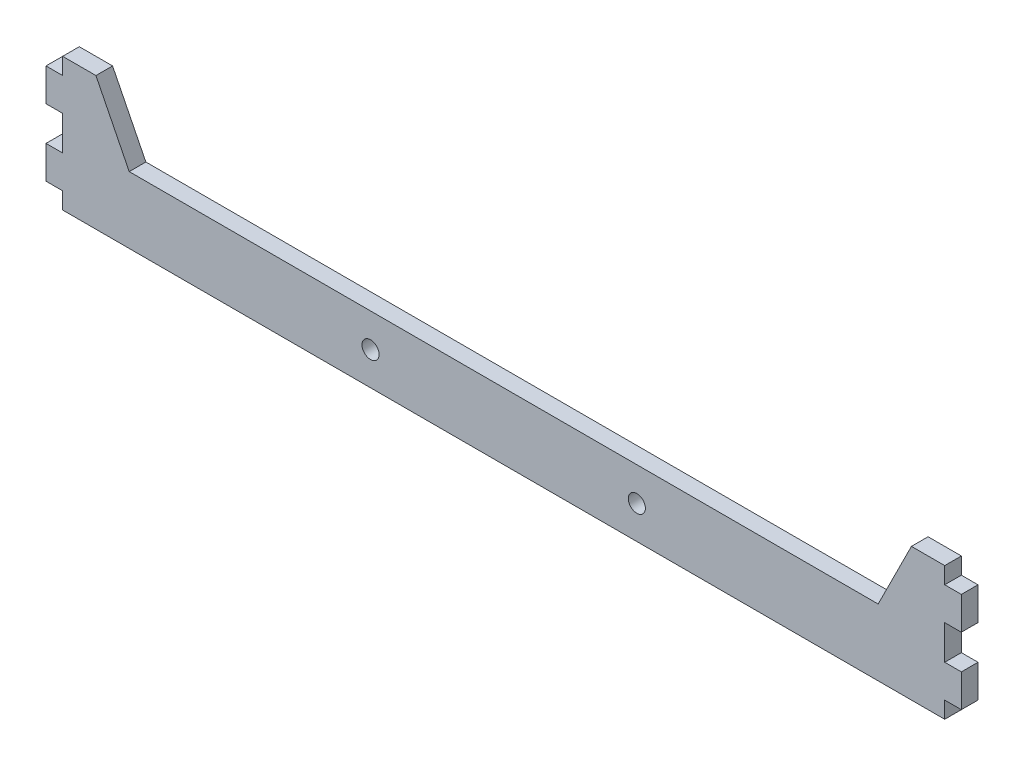
ISO-10303-21;
HEADER;
FILE_DESCRIPTION(('STEP AP214'),'2;1');
FILE_NAME('part.step','',(''),(''),'','','');
FILE_SCHEMA(('AUTOMOTIVE_DESIGN { 1 0 10303 214 1 1 1 1 }'));
ENDSEC;
DATA;
#1=APPLICATION_CONTEXT('core data for automotive mechanical design processes');
#2=APPLICATION_PROTOCOL_DEFINITION('international standard','automotive_design',2000,#1);
#3=PRODUCT_CONTEXT('',#1,'mechanical');
#4=PRODUCT('Part','Part','',(#3));
#5=PRODUCT_RELATED_PRODUCT_CATEGORY('part','',(#4));
#6=PRODUCT_DEFINITION_FORMATION('','',#4);
#7=PRODUCT_DEFINITION_CONTEXT('part definition',#1,'design');
#8=PRODUCT_DEFINITION('design','',#6,#7);
#9=PRODUCT_DEFINITION_SHAPE('','',#8);
#10=(LENGTH_UNIT() NAMED_UNIT(*) SI_UNIT(.MILLI.,.METRE.));
#11=(NAMED_UNIT(*) PLANE_ANGLE_UNIT() SI_UNIT($,.RADIAN.));
#12=(NAMED_UNIT(*) SI_UNIT($,.STERADIAN.) SOLID_ANGLE_UNIT());
#13=UNCERTAINTY_MEASURE_WITH_UNIT(LENGTH_MEASURE(1.E-05),#10,'distance_accuracy_value','');
#14=(GEOMETRIC_REPRESENTATION_CONTEXT(3) GLOBAL_UNCERTAINTY_ASSIGNED_CONTEXT((#13)) GLOBAL_UNIT_ASSIGNED_CONTEXT((#10,
#11,#12)) REPRESENTATION_CONTEXT('',''));
#15=CARTESIAN_POINT('',(0.,0.,0.));
#16=DIRECTION('',(0.,0.,1.));
#17=DIRECTION('',(1.,0.,0.));
#18=AXIS2_PLACEMENT_3D('',#15,#16,#17);
#19=CARTESIAN_POINT('',(0.,-12.7,6.35));
#20=DIRECTION('',(0.,-1.,0.));
#21=DIRECTION('',(1.,0.,0.));
#22=AXIS2_PLACEMENT_3D('',#19,#20,#21);
#23=PLANE('',#22);
#24=DIRECTION('',(-1.,0.,0.));
#25=VECTOR('',#24,1.);
#26=CARTESIAN_POINT('',(0.,-12.7,0.));
#27=LINE('',#26,#25);
#28=CARTESIAN_POINT('',(168.275,-12.7,0.));
#29=VERTEX_POINT('',#28);
#30=CARTESIAN_POINT('',(-168.275,-12.7,0.));
#31=VERTEX_POINT('',#30);
#32=EDGE_CURVE('E226',#29,#31,#27,.T.);
#33=ORIENTED_EDGE('',*,*,#32,.F.);
#34=DIRECTION('',(0.,0.,-1.));
#35=VECTOR('',#34,1.);
#36=CARTESIAN_POINT('',(168.275,-12.7,6.35));
#37=LINE('',#36,#35);
#38=CARTESIAN_POINT('',(168.275,-12.7,6.35));
#39=VERTEX_POINT('',#38);
#40=EDGE_CURVE('E11',#39,#29,#37,.T.);
#41=ORIENTED_EDGE('',*,*,#40,.F.);
#42=DIRECTION('',(-1.,0.,0.));
#43=VECTOR('',#42,1.);
#44=CARTESIAN_POINT('',(0.,-12.7,6.35));
#45=LINE('',#44,#43);
#46=CARTESIAN_POINT('',(-168.275,-12.7,6.35));
#47=VERTEX_POINT('',#46);
#48=EDGE_CURVE('E288',#39,#47,#45,.T.);
#49=ORIENTED_EDGE('',*,*,#48,.T.);
#50=DIRECTION('',(0.,0.,-1.));
#51=VECTOR('',#50,1.);
#52=CARTESIAN_POINT('',(-168.275,-12.7,6.35));
#53=LINE('',#52,#51);
#54=EDGE_CURVE('E52',#47,#31,#53,.T.);
#55=ORIENTED_EDGE('',*,*,#54,.T.);
#56=EDGE_LOOP('',(#33,#41,#49,#55));
#57=FACE_BOUND('',#56,.T.);
#58=ADVANCED_FACE('F36',(#57),#23,.T.);
#59=CARTESIAN_POINT('',(168.275,-2.94209101525652E-12,6.35));
#60=DIRECTION('',(-1.,0.,0.));
#61=DIRECTION('',(0.,-1.,0.));
#62=AXIS2_PLACEMENT_3D('',#59,#60,#61);
#63=PLANE('',#62);
#64=DIRECTION('',(0.,1.,0.));
#65=VECTOR('',#64,1.);
#66=CARTESIAN_POINT('',(168.275,-2.94209101525652E-12,0.));
#67=LINE('',#66,#65);
#68=CARTESIAN_POINT('',(168.275,-6.34999999999966,0.));
#69=VERTEX_POINT('',#68);
#70=EDGE_CURVE('E228',#29,#69,#67,.T.);
#71=ORIENTED_EDGE('',*,*,#70,.T.);
#72=DIRECTION('',(0.,0.,-1.));
#73=VECTOR('',#72,1.);
#74=CARTESIAN_POINT('',(168.275,-6.34999999999966,6.35));
#75=LINE('',#74,#73);
#76=CARTESIAN_POINT('',(168.275,-6.34999999999966,6.35));
#77=VERTEX_POINT('',#76);
#78=EDGE_CURVE('E44',#77,#69,#75,.T.);
#79=ORIENTED_EDGE('',*,*,#78,.F.);
#80=DIRECTION('',(0.,1.,0.));
#81=VECTOR('',#80,1.);
#82=CARTESIAN_POINT('',(168.275,-2.94209101525652E-12,6.35));
#83=LINE('',#82,#81);
#84=EDGE_CURVE('E359',#39,#77,#83,.T.);
#85=ORIENTED_EDGE('',*,*,#84,.F.);
#86=ORIENTED_EDGE('',*,*,#40,.T.);
#87=EDGE_LOOP('',(#71,#79,#85,#86));
#88=FACE_BOUND('',#87,.T.);
#89=ADVANCED_FACE('F420',(#88),#63,.F.);
#90=CARTESIAN_POINT('',(0.,-6.35000000000003,6.35));
#91=DIRECTION('',(0.,1.,0.));
#92=DIRECTION('',(-1.,0.,0.));
#93=AXIS2_PLACEMENT_3D('',#90,#91,#92);
#94=PLANE('',#93);
#95=DIRECTION('',(1.,0.,0.));
#96=VECTOR('',#95,1.);
#97=CARTESIAN_POINT('',(0.,-6.35000000000003,0.));
#98=LINE('',#97,#96);
#99=CARTESIAN_POINT('',(174.625,-6.34999999999965,0.));
#100=VERTEX_POINT('',#99);
#101=EDGE_CURVE('E231',#69,#100,#98,.T.);
#102=ORIENTED_EDGE('',*,*,#101,.T.);
#103=DIRECTION('',(0.,0.,-1.));
#104=VECTOR('',#103,1.);
#105=CARTESIAN_POINT('',(174.625,-6.34999999999965,6.35));
#106=LINE('',#105,#104);
#107=CARTESIAN_POINT('',(174.625,-6.34999999999965,6.35));
#108=VERTEX_POINT('',#107);
#109=EDGE_CURVE('E331',#108,#100,#106,.T.);
#110=ORIENTED_EDGE('',*,*,#109,.F.);
#111=DIRECTION('',(1.,0.,0.));
#112=VECTOR('',#111,1.);
#113=CARTESIAN_POINT('',(0.,-6.35000000000003,6.35));
#114=LINE('',#113,#112);
#115=EDGE_CURVE('E340',#77,#108,#114,.T.);
#116=ORIENTED_EDGE('',*,*,#115,.F.);
#117=ORIENTED_EDGE('',*,*,#78,.T.);
#118=EDGE_LOOP('',(#102,#110,#116,#117));
#119=FACE_BOUND('',#118,.T.);
#120=ADVANCED_FACE('F338',(#119),#94,.F.);
#121=CARTESIAN_POINT('',(174.625,7.75490782700672E-13,6.35));
#122=DIRECTION('',(-1.,0.,0.));
#123=DIRECTION('',(0.,-1.,0.));
#124=AXIS2_PLACEMENT_3D('',#121,#122,#123);
#125=PLANE('',#124);
#126=DIRECTION('',(0.,1.,0.));
#127=VECTOR('',#126,1.);
#128=CARTESIAN_POINT('',(174.625,7.75490782700672E-13,0.));
#129=LINE('',#128,#127);
#130=CARTESIAN_POINT('',(174.625,6.15000000000035,0.));
#131=VERTEX_POINT('',#130);
#132=EDGE_CURVE('E233',#100,#131,#129,.T.);
#133=ORIENTED_EDGE('',*,*,#132,.T.);
#134=DIRECTION('',(0.,0.,-1.));
#135=VECTOR('',#134,1.);
#136=CARTESIAN_POINT('',(174.625,6.15000000000035,6.35));
#137=LINE('',#136,#135);
#138=CARTESIAN_POINT('',(174.625,6.15000000000035,6.35));
#139=VERTEX_POINT('',#138);
#140=EDGE_CURVE('E329',#139,#131,#137,.T.);
#141=ORIENTED_EDGE('',*,*,#140,.F.);
#142=DIRECTION('',(0.,1.,0.));
#143=VECTOR('',#142,1.);
#144=CARTESIAN_POINT('',(174.625,7.75490782700672E-13,6.35));
#145=LINE('',#144,#143);
#146=EDGE_CURVE('E353',#108,#139,#145,.T.);
#147=ORIENTED_EDGE('',*,*,#146,.F.);
#148=ORIENTED_EDGE('',*,*,#109,.T.);
#149=EDGE_LOOP('',(#133,#141,#147,#148));
#150=FACE_BOUND('',#149,.T.);
#151=ADVANCED_FACE('F350',(#150),#125,.F.);
#152=CARTESIAN_POINT('',(0.,6.15000000000002,6.35));
#153=DIRECTION('',(0.,1.,0.));
#154=DIRECTION('',(-1.,0.,0.));
#155=AXIS2_PLACEMENT_3D('',#152,#153,#154);
#156=PLANE('',#155);
#157=DIRECTION('',(1.,0.,0.));
#158=VECTOR('',#157,1.);
#159=CARTESIAN_POINT('',(0.,6.15000000000002,0.));
#160=LINE('',#159,#158);
#161=CARTESIAN_POINT('',(168.275,6.15000000000034,0.));
#162=VERTEX_POINT('',#161);
#163=EDGE_CURVE('E236',#162,#131,#160,.T.);
#164=ORIENTED_EDGE('',*,*,#163,.F.);
#165=DIRECTION('',(0.,0.,-1.));
#166=VECTOR('',#165,1.);
#167=CARTESIAN_POINT('',(168.275,6.15000000000034,6.35));
#168=LINE('',#167,#166);
#169=CARTESIAN_POINT('',(168.275,6.15000000000034,6.35));
#170=VERTEX_POINT('',#169);
#171=EDGE_CURVE('E327',#170,#162,#168,.T.);
#172=ORIENTED_EDGE('',*,*,#171,.F.);
#173=DIRECTION('',(1.,0.,0.));
#174=VECTOR('',#173,1.);
#175=CARTESIAN_POINT('',(0.,6.15000000000002,6.35));
#176=LINE('',#175,#174);
#177=EDGE_CURVE('E355',#170,#139,#176,.T.);
#178=ORIENTED_EDGE('',*,*,#177,.T.);
#179=ORIENTED_EDGE('',*,*,#140,.T.);
#180=EDGE_LOOP('',(#164,#172,#178,#179));
#181=FACE_BOUND('',#180,.T.);
#182=ADVANCED_FACE('F649',(#181),#156,.T.);
#183=CARTESIAN_POINT('',(168.275,1.42612808754815E-12,6.35));
#184=DIRECTION('',(-1.,0.,0.));
#185=DIRECTION('',(0.,-1.,0.));
#186=AXIS2_PLACEMENT_3D('',#183,#184,#185);
#187=PLANE('',#186);
#188=DIRECTION('',(0.,1.,0.));
#189=VECTOR('',#188,1.);
#190=CARTESIAN_POINT('',(168.275,1.42612808754815E-12,0.));
#191=LINE('',#190,#189);
#192=CARTESIAN_POINT('',(168.275,19.2500000000003,0.));
#193=VERTEX_POINT('',#192);
#194=EDGE_CURVE('E239',#162,#193,#191,.T.);
#195=ORIENTED_EDGE('',*,*,#194,.T.);
#196=DIRECTION('',(0.,0.,-1.));
#197=VECTOR('',#196,1.);
#198=CARTESIAN_POINT('',(168.275,19.2500000000003,6.35));
#199=LINE('',#198,#197);
#200=CARTESIAN_POINT('',(168.275,19.2500000000003,6.35));
#201=VERTEX_POINT('',#200);
#202=EDGE_CURVE('E324',#201,#193,#199,.T.);
#203=ORIENTED_EDGE('',*,*,#202,.F.);
#204=DIRECTION('',(0.,1.,0.));
#205=VECTOR('',#204,1.);
#206=CARTESIAN_POINT('',(168.275,1.42612808754815E-12,6.35));
#207=LINE('',#206,#205);
#208=EDGE_CURVE('E357',#170,#201,#207,.T.);
#209=ORIENTED_EDGE('',*,*,#208,.F.);
#210=ORIENTED_EDGE('',*,*,#171,.T.);
#211=EDGE_LOOP('',(#195,#203,#209,#210));
#212=FACE_BOUND('',#211,.T.);
#213=ADVANCED_FACE('F639',(#212),#187,.F.);
#214=CARTESIAN_POINT('',(0.,19.25,6.35));
#215=DIRECTION('',(0.,1.,0.));
#216=DIRECTION('',(-1.,0.,0.));
#217=AXIS2_PLACEMENT_3D('',#214,#215,#216);
#218=PLANE('',#217);
#219=DIRECTION('',(1.,0.,0.));
#220=VECTOR('',#219,1.);
#221=CARTESIAN_POINT('',(0.,19.25,0.));
#222=LINE('',#221,#220);
#223=CARTESIAN_POINT('',(174.625,19.2500000000004,0.));
#224=VERTEX_POINT('',#223);
#225=EDGE_CURVE('E241',#193,#224,#222,.T.);
#226=ORIENTED_EDGE('',*,*,#225,.T.);
#227=DIRECTION('',(0.,0.,-1.));
#228=VECTOR('',#227,1.);
#229=CARTESIAN_POINT('',(174.625,19.2500000000004,6.35));
#230=LINE('',#229,#228);
#231=CARTESIAN_POINT('',(174.625,19.2500000000004,6.35));
#232=VERTEX_POINT('',#231);
#233=EDGE_CURVE('E322',#232,#224,#230,.T.);
#234=ORIENTED_EDGE('',*,*,#233,.F.);
#235=DIRECTION('',(1.,0.,0.));
#236=VECTOR('',#235,1.);
#237=CARTESIAN_POINT('',(0.,19.25,6.35));
#238=LINE('',#237,#236);
#239=EDGE_CURVE('E364',#201,#232,#238,.T.);
#240=ORIENTED_EDGE('',*,*,#239,.F.);
#241=ORIENTED_EDGE('',*,*,#202,.T.);
#242=EDGE_LOOP('',(#226,#234,#240,#241));
#243=FACE_BOUND('',#242,.T.);
#244=ADVANCED_FACE('F629',(#243),#218,.F.);
#245=CARTESIAN_POINT('',(174.625,7.75490782700672E-13,6.35));
#246=DIRECTION('',(1.,0.,0.));
#247=DIRECTION('',(0.,1.,0.));
#248=AXIS2_PLACEMENT_3D('',#245,#246,#247);
#249=PLANE('',#248);
#250=DIRECTION('',(0.,-1.,0.));
#251=VECTOR('',#250,1.);
#252=CARTESIAN_POINT('',(174.625,7.75490782700672E-13,0.));
#253=LINE('',#252,#251);
#254=CARTESIAN_POINT('',(174.625,31.7500000000004,0.));
#255=VERTEX_POINT('',#254);
#256=EDGE_CURVE('E244',#255,#224,#253,.T.);
#257=ORIENTED_EDGE('',*,*,#256,.F.);
#258=DIRECTION('',(0.,0.,-1.));
#259=VECTOR('',#258,1.);
#260=CARTESIAN_POINT('',(174.625,31.7500000000004,6.35));
#261=LINE('',#260,#259);
#262=CARTESIAN_POINT('',(174.625,31.7500000000004,6.35));
#263=VERTEX_POINT('',#262);
#264=EDGE_CURVE('E320',#263,#255,#261,.T.);
#265=ORIENTED_EDGE('',*,*,#264,.F.);
#266=DIRECTION('',(0.,-1.,0.));
#267=VECTOR('',#266,1.);
#268=CARTESIAN_POINT('',(174.625,7.75490782700672E-13,6.35));
#269=LINE('',#268,#267);
#270=EDGE_CURVE('E366',#263,#232,#269,.T.);
#271=ORIENTED_EDGE('',*,*,#270,.T.);
#272=ORIENTED_EDGE('',*,*,#233,.T.);
#273=EDGE_LOOP('',(#257,#265,#271,#272));
#274=FACE_BOUND('',#273,.T.);
#275=ADVANCED_FACE('F619',(#274),#249,.T.);
#276=CARTESIAN_POINT('',(0.,31.75,6.35));
#277=DIRECTION('',(0.,1.,0.));
#278=DIRECTION('',(-1.,0.,0.));
#279=AXIS2_PLACEMENT_3D('',#276,#277,#278);
#280=PLANE('',#279);
#281=DIRECTION('',(1.,0.,0.));
#282=VECTOR('',#281,1.);
#283=CARTESIAN_POINT('',(0.,31.75,0.));
#284=LINE('',#283,#282);
#285=CARTESIAN_POINT('',(168.275,31.7500000000003,0.));
#286=VERTEX_POINT('',#285);
#287=EDGE_CURVE('E247',#286,#255,#284,.T.);
#288=ORIENTED_EDGE('',*,*,#287,.F.);
#289=DIRECTION('',(0.,0.,-1.));
#290=VECTOR('',#289,1.);
#291=CARTESIAN_POINT('',(168.275,31.7500000000003,6.35));
#292=LINE('',#291,#290);
#293=CARTESIAN_POINT('',(168.275,31.7500000000003,6.35));
#294=VERTEX_POINT('',#293);
#295=EDGE_CURVE('E318',#294,#286,#292,.T.);
#296=ORIENTED_EDGE('',*,*,#295,.F.);
#297=DIRECTION('',(1.,0.,0.));
#298=VECTOR('',#297,1.);
#299=CARTESIAN_POINT('',(0.,31.75,6.35));
#300=LINE('',#299,#298);
#301=EDGE_CURVE('E369',#294,#263,#300,.T.);
#302=ORIENTED_EDGE('',*,*,#301,.T.);
#303=ORIENTED_EDGE('',*,*,#264,.T.);
#304=EDGE_LOOP('',(#288,#296,#302,#303));
#305=FACE_BOUND('',#304,.T.);
#306=ADVANCED_FACE('F609',(#305),#280,.T.);
#307=CARTESIAN_POINT('',(168.275,0.,6.35));
#308=DIRECTION('',(-1.,0.,0.));
#309=DIRECTION('',(0.,0.,1.));
#310=AXIS2_PLACEMENT_3D('',#307,#308,#309);
#311=PLANE('',#310);
#312=DIRECTION('',(0.,1.,0.));
#313=VECTOR('',#312,1.);
#314=CARTESIAN_POINT('',(168.275,0.,0.));
#315=LINE('',#314,#313);
#316=CARTESIAN_POINT('',(168.275,38.1000000000003,0.));
#317=VERTEX_POINT('',#316);
#318=EDGE_CURVE('E250',#286,#317,#315,.T.);
#319=ORIENTED_EDGE('',*,*,#318,.T.);
#320=DIRECTION('',(0.,0.,-1.));
#321=VECTOR('',#320,1.);
#322=CARTESIAN_POINT('',(168.275,38.1000000000003,6.35));
#323=LINE('',#322,#321);
#324=CARTESIAN_POINT('',(168.275,38.1000000000003,6.35));
#325=VERTEX_POINT('',#324);
#326=EDGE_CURVE('E315',#325,#317,#323,.T.);
#327=ORIENTED_EDGE('',*,*,#326,.F.);
#328=DIRECTION('',(0.,1.,0.));
#329=VECTOR('',#328,1.);
#330=CARTESIAN_POINT('',(168.275,0.,6.35));
#331=LINE('',#330,#329);
#332=EDGE_CURVE('E372',#294,#325,#331,.T.);
#333=ORIENTED_EDGE('',*,*,#332,.F.);
#334=ORIENTED_EDGE('',*,*,#295,.T.);
#335=EDGE_LOOP('',(#319,#327,#333,#334));
#336=FACE_BOUND('',#335,.T.);
#337=ADVANCED_FACE('F599',(#336),#311,.F.);
#338=CARTESIAN_POINT('',(0.,38.1,6.35));
#339=DIRECTION('',(0.,-1.,0.));
#340=DIRECTION('',(1.,0.,0.));
#341=AXIS2_PLACEMENT_3D('',#338,#339,#340);
#342=PLANE('',#341);
#343=DIRECTION('',(-1.,0.,0.));
#344=VECTOR('',#343,1.);
#345=CARTESIAN_POINT('',(0.,38.1,0.));
#346=LINE('',#345,#344);
#347=CARTESIAN_POINT('',(155.575,38.1000000000003,0.));
#348=VERTEX_POINT('',#347);
#349=EDGE_CURVE('E252',#317,#348,#346,.T.);
#350=ORIENTED_EDGE('',*,*,#349,.T.);
#351=DIRECTION('',(0.,0.,-1.));
#352=VECTOR('',#351,1.);
#353=CARTESIAN_POINT('',(155.575,38.1000000000003,6.35));
#354=LINE('',#353,#352);
#355=CARTESIAN_POINT('',(155.575,38.1000000000003,6.35));
#356=VERTEX_POINT('',#355);
#357=EDGE_CURVE('E312',#356,#348,#354,.T.);
#358=ORIENTED_EDGE('',*,*,#357,.F.);
#359=DIRECTION('',(-1.,0.,0.));
#360=VECTOR('',#359,1.);
#361=CARTESIAN_POINT('',(0.,38.1,6.35));
#362=LINE('',#361,#360);
#363=EDGE_CURVE('E374',#325,#356,#362,.T.);
#364=ORIENTED_EDGE('',*,*,#363,.F.);
#365=ORIENTED_EDGE('',*,*,#326,.T.);
#366=EDGE_LOOP('',(#350,#358,#364,#365));
#367=FACE_BOUND('',#366,.T.);
#368=ADVANCED_FACE('F588',(#367),#342,.F.);
#369=CARTESIAN_POINT('',(109.220000000001,-54.6099999999995,6.35));
#370=DIRECTION('',(0.894427190999919,-0.447213595499952,0.));
#371=DIRECTION('',(0.447213595499953,0.894427190999919,0.));
#372=AXIS2_PLACEMENT_3D('',#369,#370,#371);
#373=PLANE('',#372);
#374=DIRECTION('',(-0.447213595499953,-0.894427190999919,0.));
#375=VECTOR('',#374,1.);
#376=CARTESIAN_POINT('',(109.220000000001,-54.6099999999995,0.));
#377=LINE('',#376,#375);
#378=CARTESIAN_POINT('',(142.875,12.7,0.));
#379=VERTEX_POINT('',#378);
#380=EDGE_CURVE('E254',#348,#379,#377,.T.);
#381=ORIENTED_EDGE('',*,*,#380,.T.);
#382=DIRECTION('',(0.,0.,-1.));
#383=VECTOR('',#382,1.);
#384=CARTESIAN_POINT('',(142.875,12.7,6.35));
#385=LINE('',#384,#383);
#386=CARTESIAN_POINT('',(142.875,12.7,6.35));
#387=VERTEX_POINT('',#386);
#388=EDGE_CURVE('E309',#387,#379,#385,.T.);
#389=ORIENTED_EDGE('',*,*,#388,.F.);
#390=DIRECTION('',(-0.447213595499953,-0.894427190999919,0.));
#391=VECTOR('',#390,1.);
#392=CARTESIAN_POINT('',(109.220000000001,-54.6099999999995,6.35));
#393=LINE('',#392,#391);
#394=EDGE_CURVE('E376',#356,#387,#393,.T.);
#395=ORIENTED_EDGE('',*,*,#394,.F.);
#396=ORIENTED_EDGE('',*,*,#357,.T.);
#397=EDGE_LOOP('',(#381,#389,#395,#396));
#398=FACE_BOUND('',#397,.T.);
#399=ADVANCED_FACE('F577',(#398),#373,.F.);
#400=CARTESIAN_POINT('',(0.,12.7,6.35));
#401=DIRECTION('',(0.,-1.,0.));
#402=DIRECTION('',(1.,0.,0.));
#403=AXIS2_PLACEMENT_3D('',#400,#401,#402);
#404=PLANE('',#403);
#405=DIRECTION('',(-1.,0.,0.));
#406=VECTOR('',#405,1.);
#407=CARTESIAN_POINT('',(0.,12.7,0.));
#408=LINE('',#407,#406);
#409=CARTESIAN_POINT('',(-142.875,12.7,0.));
#410=VERTEX_POINT('',#409);
#411=EDGE_CURVE('E256',#379,#410,#408,.T.);
#412=ORIENTED_EDGE('',*,*,#411,.T.);
#413=DIRECTION('',(0.,0.,-1.));
#414=VECTOR('',#413,1.);
#415=CARTESIAN_POINT('',(-142.875,12.7,6.35));
#416=LINE('',#415,#414);
#417=CARTESIAN_POINT('',(-142.875,12.7,6.35));
#418=VERTEX_POINT('',#417);
#419=EDGE_CURVE('E307',#418,#410,#416,.T.);
#420=ORIENTED_EDGE('',*,*,#419,.F.);
#421=DIRECTION('',(-1.,0.,0.));
#422=VECTOR('',#421,1.);
#423=CARTESIAN_POINT('',(0.,12.7,6.35));
#424=LINE('',#423,#422);
#425=EDGE_CURVE('E378',#387,#418,#424,.T.);
#426=ORIENTED_EDGE('',*,*,#425,.F.);
#427=ORIENTED_EDGE('',*,*,#388,.T.);
#428=EDGE_LOOP('',(#412,#420,#426,#427));
#429=FACE_BOUND('',#428,.T.);
#430=ADVANCED_FACE('F567',(#429),#404,.F.);
#431=CARTESIAN_POINT('',(-109.22,-54.61,6.35));
#432=DIRECTION('',(0.894427190999916,0.447213595499958,0.));
#433=DIRECTION('',(-0.447213595499958,0.894427190999916,0.));
#434=AXIS2_PLACEMENT_3D('',#431,#432,#433);
#435=PLANE('',#434);
#436=DIRECTION('',(0.447213595499958,-0.894427190999916,0.));
#437=VECTOR('',#436,1.);
#438=CARTESIAN_POINT('',(-109.22,-54.61,0.));
#439=LINE('',#438,#437);
#440=CARTESIAN_POINT('',(-155.575,38.1,0.));
#441=VERTEX_POINT('',#440);
#442=EDGE_CURVE('E259',#441,#410,#439,.T.);
#443=ORIENTED_EDGE('',*,*,#442,.F.);
#444=DIRECTION('',(0.,0.,-1.));
#445=VECTOR('',#444,1.);
#446=CARTESIAN_POINT('',(-155.575,38.1,6.35));
#447=LINE('',#446,#445);
#448=CARTESIAN_POINT('',(-155.575,38.1,6.35));
#449=VERTEX_POINT('',#448);
#450=EDGE_CURVE('E305',#449,#441,#447,.T.);
#451=ORIENTED_EDGE('',*,*,#450,.F.);
#452=DIRECTION('',(0.447213595499958,-0.894427190999916,0.));
#453=VECTOR('',#452,1.);
#454=CARTESIAN_POINT('',(-109.22,-54.61,6.35));
#455=LINE('',#454,#453);
#456=EDGE_CURVE('E380',#449,#418,#455,.T.);
#457=ORIENTED_EDGE('',*,*,#456,.T.);
#458=ORIENTED_EDGE('',*,*,#419,.T.);
#459=EDGE_LOOP('',(#443,#451,#457,#458));
#460=FACE_BOUND('',#459,.T.);
#461=ADVANCED_FACE('F557',(#460),#435,.T.);
#462=CARTESIAN_POINT('',(0.,38.1,6.35));
#463=DIRECTION('',(0.,1.,0.));
#464=DIRECTION('',(0.,0.,1.));
#465=AXIS2_PLACEMENT_3D('',#462,#463,#464);
#466=PLANE('',#465);
#467=DIRECTION('',(1.,0.,0.));
#468=VECTOR('',#467,1.);
#469=CARTESIAN_POINT('',(0.,38.1,0.));
#470=LINE('',#469,#468);
#471=CARTESIAN_POINT('',(-168.275,38.1,0.));
#472=VERTEX_POINT('',#471);
#473=EDGE_CURVE('E262',#472,#441,#470,.T.);
#474=ORIENTED_EDGE('',*,*,#473,.F.);
#475=DIRECTION('',(0.,0.,-1.));
#476=VECTOR('',#475,1.);
#477=CARTESIAN_POINT('',(-168.275,38.1,6.35));
#478=LINE('',#477,#476);
#479=CARTESIAN_POINT('',(-168.275,38.1,6.35));
#480=VERTEX_POINT('',#479);
#481=EDGE_CURVE('E303',#480,#472,#478,.T.);
#482=ORIENTED_EDGE('',*,*,#481,.F.);
#483=DIRECTION('',(1.,0.,0.));
#484=VECTOR('',#483,1.);
#485=CARTESIAN_POINT('',(0.,38.1,6.35));
#486=LINE('',#485,#484);
#487=EDGE_CURVE('E383',#480,#449,#486,.T.);
#488=ORIENTED_EDGE('',*,*,#487,.T.);
#489=ORIENTED_EDGE('',*,*,#450,.T.);
#490=EDGE_LOOP('',(#474,#482,#488,#489));
#491=FACE_BOUND('',#490,.T.);
#492=ADVANCED_FACE('F547',(#491),#466,.T.);
#493=CARTESIAN_POINT('',(-168.275,0.,6.35));
#494=DIRECTION('',(-1.,0.,0.));
#495=DIRECTION('',(0.,0.,1.));
#496=AXIS2_PLACEMENT_3D('',#493,#494,#495);
#497=PLANE('',#496);
#498=DIRECTION('',(0.,1.,0.));
#499=VECTOR('',#498,1.);
#500=CARTESIAN_POINT('',(-168.275,0.,0.));
#501=LINE('',#500,#499);
#502=CARTESIAN_POINT('',(-168.275,31.75,0.));
#503=VERTEX_POINT('',#502);
#504=EDGE_CURVE('E265',#503,#472,#501,.T.);
#505=ORIENTED_EDGE('',*,*,#504,.F.);
#506=DIRECTION('',(0.,0.,-1.));
#507=VECTOR('',#506,1.);
#508=CARTESIAN_POINT('',(-168.275,31.75,6.35));
#509=LINE('',#508,#507);
#510=CARTESIAN_POINT('',(-168.275,31.75,6.35));
#511=VERTEX_POINT('',#510);
#512=EDGE_CURVE('E301',#511,#503,#509,.T.);
#513=ORIENTED_EDGE('',*,*,#512,.F.);
#514=DIRECTION('',(0.,1.,0.));
#515=VECTOR('',#514,1.);
#516=CARTESIAN_POINT('',(-168.275,0.,6.35));
#517=LINE('',#516,#515);
#518=EDGE_CURVE('E386',#511,#480,#517,.T.);
#519=ORIENTED_EDGE('',*,*,#518,.T.);
#520=ORIENTED_EDGE('',*,*,#481,.T.);
#521=EDGE_LOOP('',(#505,#513,#519,#520));
#522=FACE_BOUND('',#521,.T.);
#523=ADVANCED_FACE('F537',(#522),#497,.T.);
#524=CARTESIAN_POINT('',(0.,31.75,6.35));
#525=DIRECTION('',(0.,-1.,0.));
#526=DIRECTION('',(0.,0.,-1.));
#527=AXIS2_PLACEMENT_3D('',#524,#525,#526);
#528=PLANE('',#527);
#529=DIRECTION('',(-1.,0.,0.));
#530=VECTOR('',#529,1.);
#531=CARTESIAN_POINT('',(0.,31.75,0.));
#532=LINE('',#531,#530);
#533=CARTESIAN_POINT('',(-174.625,31.75,0.));
#534=VERTEX_POINT('',#533);
#535=EDGE_CURVE('E268',#503,#534,#532,.T.);
#536=ORIENTED_EDGE('',*,*,#535,.T.);
#537=DIRECTION('',(0.,0.,-1.));
#538=VECTOR('',#537,1.);
#539=CARTESIAN_POINT('',(-174.625,31.75,6.35));
#540=LINE('',#539,#538);
#541=CARTESIAN_POINT('',(-174.625,31.75,6.35));
#542=VERTEX_POINT('',#541);
#543=EDGE_CURVE('E298',#542,#534,#540,.T.);
#544=ORIENTED_EDGE('',*,*,#543,.F.);
#545=DIRECTION('',(-1.,0.,0.));
#546=VECTOR('',#545,1.);
#547=CARTESIAN_POINT('',(0.,31.75,6.35));
#548=LINE('',#547,#546);
#549=EDGE_CURVE('E389',#511,#542,#548,.T.);
#550=ORIENTED_EDGE('',*,*,#549,.F.);
#551=ORIENTED_EDGE('',*,*,#512,.T.);
#552=EDGE_LOOP('',(#536,#544,#550,#551));
#553=FACE_BOUND('',#552,.T.);
#554=ADVANCED_FACE('F527',(#553),#528,.F.);
#555=CARTESIAN_POINT('',(-174.625,0.,6.35));
#556=DIRECTION('',(1.,0.,0.));
#557=DIRECTION('',(0.,0.,-1.));
#558=AXIS2_PLACEMENT_3D('',#555,#556,#557);
#559=PLANE('',#558);
#560=DIRECTION('',(0.,-1.,0.));
#561=VECTOR('',#560,1.);
#562=CARTESIAN_POINT('',(-174.625,0.,0.));
#563=LINE('',#562,#561);
#564=CARTESIAN_POINT('',(-174.625,19.25,0.));
#565=VERTEX_POINT('',#564);
#566=EDGE_CURVE('E270',#534,#565,#563,.T.);
#567=ORIENTED_EDGE('',*,*,#566,.T.);
#568=DIRECTION('',(0.,0.,-1.));
#569=VECTOR('',#568,1.);
#570=CARTESIAN_POINT('',(-174.625,19.25,6.35));
#571=LINE('',#570,#569);
#572=CARTESIAN_POINT('',(-174.625,19.25,6.35));
#573=VERTEX_POINT('',#572);
#574=EDGE_CURVE('E296',#573,#565,#571,.T.);
#575=ORIENTED_EDGE('',*,*,#574,.F.);
#576=DIRECTION('',(0.,-1.,0.));
#577=VECTOR('',#576,1.);
#578=CARTESIAN_POINT('',(-174.625,0.,6.35));
#579=LINE('',#578,#577);
#580=EDGE_CURVE('E391',#542,#573,#579,.T.);
#581=ORIENTED_EDGE('',*,*,#580,.F.);
#582=ORIENTED_EDGE('',*,*,#543,.T.);
#583=EDGE_LOOP('',(#567,#575,#581,#582));
#584=FACE_BOUND('',#583,.T.);
#585=ADVANCED_FACE('F518',(#584),#559,.F.);
#586=CARTESIAN_POINT('',(0.,19.25,6.35));
#587=DIRECTION('',(0.,-1.,0.));
#588=DIRECTION('',(0.,0.,-1.));
#589=AXIS2_PLACEMENT_3D('',#586,#587,#588);
#590=PLANE('',#589);
#591=DIRECTION('',(-1.,0.,0.));
#592=VECTOR('',#591,1.);
#593=CARTESIAN_POINT('',(0.,19.25,0.));
#594=LINE('',#593,#592);
#595=CARTESIAN_POINT('',(-168.275,19.25,0.));
#596=VERTEX_POINT('',#595);
#597=EDGE_CURVE('E273',#596,#565,#594,.T.);
#598=ORIENTED_EDGE('',*,*,#597,.F.);
#599=DIRECTION('',(0.,0.,-1.));
#600=VECTOR('',#599,1.);
#601=CARTESIAN_POINT('',(-168.275,19.25,6.35));
#602=LINE('',#601,#600);
#603=CARTESIAN_POINT('',(-168.275,19.25,6.35));
#604=VERTEX_POINT('',#603);
#605=EDGE_CURVE('E294',#604,#596,#602,.T.);
#606=ORIENTED_EDGE('',*,*,#605,.F.);
#607=DIRECTION('',(-1.,0.,0.));
#608=VECTOR('',#607,1.);
#609=CARTESIAN_POINT('',(0.,19.25,6.35));
#610=LINE('',#609,#608);
#611=EDGE_CURVE('E393',#604,#573,#610,.T.);
#612=ORIENTED_EDGE('',*,*,#611,.T.);
#613=ORIENTED_EDGE('',*,*,#574,.T.);
#614=EDGE_LOOP('',(#598,#606,#612,#613));
#615=FACE_BOUND('',#614,.T.);
#616=ADVANCED_FACE('F406',(#615),#590,.T.);
#617=CARTESIAN_POINT('',(-168.275,0.,6.35));
#618=DIRECTION('',(-1.,0.,0.));
#619=DIRECTION('',(0.,0.,1.));
#620=AXIS2_PLACEMENT_3D('',#617,#618,#619);
#621=PLANE('',#620);
#622=DIRECTION('',(0.,1.,0.));
#623=VECTOR('',#622,1.);
#624=CARTESIAN_POINT('',(-168.275,0.,0.));
#625=LINE('',#624,#623);
#626=CARTESIAN_POINT('',(-168.275,6.14999999999997,0.));
#627=VERTEX_POINT('',#626);
#628=EDGE_CURVE('E276',#627,#596,#625,.T.);
#629=ORIENTED_EDGE('',*,*,#628,.F.);
#630=DIRECTION('',(0.,0.,-1.));
#631=VECTOR('',#630,1.);
#632=CARTESIAN_POINT('',(-168.275,6.14999999999997,6.35));
#633=LINE('',#632,#631);
#634=CARTESIAN_POINT('',(-168.275,6.14999999999997,6.35));
#635=VERTEX_POINT('',#634);
#636=EDGE_CURVE('E292',#635,#627,#633,.T.);
#637=ORIENTED_EDGE('',*,*,#636,.F.);
#638=DIRECTION('',(0.,1.,0.));
#639=VECTOR('',#638,1.);
#640=CARTESIAN_POINT('',(-168.275,0.,6.35));
#641=LINE('',#640,#639);
#642=EDGE_CURVE('E396',#635,#604,#641,.T.);
#643=ORIENTED_EDGE('',*,*,#642,.T.);
#644=ORIENTED_EDGE('',*,*,#605,.T.);
#645=EDGE_LOOP('',(#629,#637,#643,#644));
#646=FACE_BOUND('',#645,.T.);
#647=ADVANCED_FACE('F400',(#646),#621,.T.);
#648=CARTESIAN_POINT('',(0.,6.15000000000002,6.35));
#649=DIRECTION('',(0.,-1.,0.));
#650=DIRECTION('',(1.,0.,0.));
#651=AXIS2_PLACEMENT_3D('',#648,#649,#650);
#652=PLANE('',#651);
#653=DIRECTION('',(-1.,0.,0.));
#654=VECTOR('',#653,1.);
#655=CARTESIAN_POINT('',(0.,6.15000000000002,0.));
#656=LINE('',#655,#654);
#657=CARTESIAN_POINT('',(-174.625,6.14999999999997,0.));
#658=VERTEX_POINT('',#657);
#659=EDGE_CURVE('E279',#627,#658,#656,.T.);
#660=ORIENTED_EDGE('',*,*,#659,.T.);
#661=DIRECTION('',(0.,0.,-1.));
#662=VECTOR('',#661,1.);
#663=CARTESIAN_POINT('',(-174.625,6.14999999999997,6.35));
#664=LINE('',#663,#662);
#665=CARTESIAN_POINT('',(-174.625,6.14999999999997,6.35));
#666=VERTEX_POINT('',#665);
#667=EDGE_CURVE('E207',#666,#658,#664,.T.);
#668=ORIENTED_EDGE('',*,*,#667,.F.);
#669=DIRECTION('',(-1.,0.,0.));
#670=VECTOR('',#669,1.);
#671=CARTESIAN_POINT('',(0.,6.15000000000002,6.35));
#672=LINE('',#671,#670);
#673=EDGE_CURVE('E217',#635,#666,#672,.T.);
#674=ORIENTED_EDGE('',*,*,#673,.F.);
#675=ORIENTED_EDGE('',*,*,#636,.T.);
#676=EDGE_LOOP('',(#660,#668,#674,#675));
#677=FACE_BOUND('',#676,.T.);
#678=ADVANCED_FACE('F410',(#677),#652,.F.);
#679=CARTESIAN_POINT('',(-174.625,0.,6.35));
#680=DIRECTION('',(-1.,0.,0.));
#681=DIRECTION('',(0.,0.,1.));
#682=AXIS2_PLACEMENT_3D('',#679,#680,#681);
#683=PLANE('',#682);
#684=DIRECTION('',(0.,1.,0.));
#685=VECTOR('',#684,1.);
#686=CARTESIAN_POINT('',(-174.625,0.,0.));
#687=LINE('',#686,#685);
#688=CARTESIAN_POINT('',(-174.625,-6.35000000000003,0.));
#689=VERTEX_POINT('',#688);
#690=EDGE_CURVE('E203',#689,#658,#687,.T.);
#691=ORIENTED_EDGE('',*,*,#690,.F.);
#692=DIRECTION('',(0.,0.,-1.));
#693=VECTOR('',#692,1.);
#694=CARTESIAN_POINT('',(-174.625,-6.35000000000003,6.35));
#695=LINE('',#694,#693);
#696=CARTESIAN_POINT('',(-174.625,-6.35000000000003,6.35));
#697=VERTEX_POINT('',#696);
#698=EDGE_CURVE('E198',#697,#689,#695,.T.);
#699=ORIENTED_EDGE('',*,*,#698,.F.);
#700=DIRECTION('',(0.,1.,0.));
#701=VECTOR('',#700,1.);
#702=CARTESIAN_POINT('',(-174.625,0.,6.35));
#703=LINE('',#702,#701);
#704=EDGE_CURVE('E201',#697,#666,#703,.T.);
#705=ORIENTED_EDGE('',*,*,#704,.T.);
#706=ORIENTED_EDGE('',*,*,#667,.T.);
#707=EDGE_LOOP('',(#691,#699,#705,#706));
#708=FACE_BOUND('',#707,.T.);
#709=ADVANCED_FACE('F200',(#708),#683,.T.);
#710=CARTESIAN_POINT('',(0.,-6.35000000000003,6.35));
#711=DIRECTION('',(0.,-1.,0.));
#712=DIRECTION('',(0.,0.,-1.));
#713=AXIS2_PLACEMENT_3D('',#710,#711,#712);
#714=PLANE('',#713);
#715=DIRECTION('',(-1.,0.,0.));
#716=VECTOR('',#715,1.);
#717=CARTESIAN_POINT('',(0.,-6.35000000000003,0.));
#718=LINE('',#717,#716);
#719=CARTESIAN_POINT('',(-168.275,-6.35000000000003,0.));
#720=VERTEX_POINT('',#719);
#721=EDGE_CURVE('E283',#720,#689,#718,.T.);
#722=ORIENTED_EDGE('',*,*,#721,.F.);
#723=DIRECTION('',(0.,0.,-1.));
#724=VECTOR('',#723,1.);
#725=CARTESIAN_POINT('',(-168.275,-6.35000000000003,6.35));
#726=LINE('',#725,#724);
#727=CARTESIAN_POINT('',(-168.275,-6.35000000000003,6.35));
#728=VERTEX_POINT('',#727);
#729=EDGE_CURVE('E125',#728,#720,#726,.T.);
#730=ORIENTED_EDGE('',*,*,#729,.F.);
#731=DIRECTION('',(-1.,0.,0.));
#732=VECTOR('',#731,1.);
#733=CARTESIAN_POINT('',(0.,-6.35000000000003,6.35));
#734=LINE('',#733,#732);
#735=EDGE_CURVE('E214',#728,#697,#734,.T.);
#736=ORIENTED_EDGE('',*,*,#735,.T.);
#737=ORIENTED_EDGE('',*,*,#698,.T.);
#738=EDGE_LOOP('',(#722,#730,#736,#737));
#739=FACE_BOUND('',#738,.T.);
#740=ADVANCED_FACE('F220',(#739),#714,.T.);
#741=CARTESIAN_POINT('',(-168.275,0.,6.35));
#742=DIRECTION('',(-1.,0.,0.));
#743=DIRECTION('',(0.,0.,1.));
#744=AXIS2_PLACEMENT_3D('',#741,#742,#743);
#745=PLANE('',#744);
#746=DIRECTION('',(0.,1.,0.));
#747=VECTOR('',#746,1.);
#748=CARTESIAN_POINT('',(-168.275,0.,0.));
#749=LINE('',#748,#747);
#750=EDGE_CURVE('E285',#31,#720,#749,.T.);
#751=ORIENTED_EDGE('',*,*,#750,.F.);
#752=ORIENTED_EDGE('',*,*,#54,.F.);
#753=DIRECTION('',(0.,1.,0.));
#754=VECTOR('',#753,1.);
#755=CARTESIAN_POINT('',(-168.275,0.,6.35));
#756=LINE('',#755,#754);
#757=EDGE_CURVE('E221',#47,#728,#756,.T.);
#758=ORIENTED_EDGE('',*,*,#757,.T.);
#759=ORIENTED_EDGE('',*,*,#729,.T.);
#760=EDGE_LOOP('',(#751,#752,#758,#759));
#761=FACE_BOUND('',#760,.T.);
#762=ADVANCED_FACE('F424',(#761),#745,.T.);
#763=CARTESIAN_POINT('',(0.,0.,6.35));
#764=DIRECTION('',(0.,0.,1.));
#765=DIRECTION('',(1.,0.,0.));
#766=AXIS2_PLACEMENT_3D('',#763,#764,#765);
#767=PLANE('',#766);
#768=CARTESIAN_POINT('',(-50.8,-0.0999999999996464,6.35));
#769=DIRECTION('',(0.,0.,1.));
#770=DIRECTION('',(1.,0.,0.));
#771=AXIS2_PLACEMENT_3D('',#768,#769,#770);
#772=CIRCLE('',#771,3.2639);
#773=CARTESIAN_POINT('',(-47.5361,-0.0999999999996464,6.35));
#774=VERTEX_POINT('',#773);
#775=EDGE_CURVE('E454',#774,#774,#772,.T.);
#776=ORIENTED_EDGE('',*,*,#775,.F.);
#777=EDGE_LOOP('',(#776));
#778=FACE_BOUND('',#777,.T.);
#779=CARTESIAN_POINT('',(50.8,-0.0999999999996464,6.35));
#780=DIRECTION('',(0.,0.,1.));
#781=DIRECTION('',(1.,0.,0.));
#782=AXIS2_PLACEMENT_3D('',#779,#780,#781);
#783=CIRCLE('',#782,3.2639);
#784=CARTESIAN_POINT('',(54.0639,-0.0999999999996464,6.35));
#785=VERTEX_POINT('',#784);
#786=EDGE_CURVE('E456',#785,#785,#783,.T.);
#787=ORIENTED_EDGE('',*,*,#786,.F.);
#788=EDGE_LOOP('',(#787));
#789=FACE_BOUND('',#788,.T.);
#790=ORIENTED_EDGE('',*,*,#48,.F.);
#791=ORIENTED_EDGE('',*,*,#84,.T.);
#792=ORIENTED_EDGE('',*,*,#115,.T.);
#793=ORIENTED_EDGE('',*,*,#146,.T.);
#794=ORIENTED_EDGE('',*,*,#177,.F.);
#795=ORIENTED_EDGE('',*,*,#208,.T.);
#796=ORIENTED_EDGE('',*,*,#239,.T.);
#797=ORIENTED_EDGE('',*,*,#270,.F.);
#798=ORIENTED_EDGE('',*,*,#301,.F.);
#799=ORIENTED_EDGE('',*,*,#332,.T.);
#800=ORIENTED_EDGE('',*,*,#363,.T.);
#801=ORIENTED_EDGE('',*,*,#394,.T.);
#802=ORIENTED_EDGE('',*,*,#425,.T.);
#803=ORIENTED_EDGE('',*,*,#456,.F.);
#804=ORIENTED_EDGE('',*,*,#487,.F.);
#805=ORIENTED_EDGE('',*,*,#518,.F.);
#806=ORIENTED_EDGE('',*,*,#549,.T.);
#807=ORIENTED_EDGE('',*,*,#580,.T.);
#808=ORIENTED_EDGE('',*,*,#611,.F.);
#809=ORIENTED_EDGE('',*,*,#642,.F.);
#810=ORIENTED_EDGE('',*,*,#673,.T.);
#811=ORIENTED_EDGE('',*,*,#704,.F.);
#812=ORIENTED_EDGE('',*,*,#735,.F.);
#813=ORIENTED_EDGE('',*,*,#757,.F.);
#814=EDGE_LOOP('',(#790,#791,#792,#793,#794,#795,#796,#797,#798,#799,#800,#801,#802,#803,#804,
#805,#806,#807,#808,#809,#810,#811,#812,#813));
#815=FACE_BOUND('',#814,.T.);
#816=ADVANCED_FACE('F212',(#778,#789,#815),#767,.T.);
#817=CARTESIAN_POINT('',(0.,0.,0.));
#818=DIRECTION('',(0.,0.,1.));
#819=DIRECTION('',(1.,0.,0.));
#820=AXIS2_PLACEMENT_3D('',#817,#818,#819);
#821=PLANE('',#820);
#822=CARTESIAN_POINT('',(-50.8,-0.0999999999996464,0.));
#823=DIRECTION('',(0.,0.,1.));
#824=DIRECTION('',(1.,0.,0.));
#825=AXIS2_PLACEMENT_3D('',#822,#823,#824);
#826=CIRCLE('',#825,3.2639);
#827=CARTESIAN_POINT('',(-47.5361,-0.0999999999996464,0.));
#828=VERTEX_POINT('',#827);
#829=EDGE_CURVE('E451',#828,#828,#826,.T.);
#830=ORIENTED_EDGE('',*,*,#829,.T.);
#831=EDGE_LOOP('',(#830));
#832=FACE_BOUND('',#831,.T.);
#833=CARTESIAN_POINT('',(50.8,-0.0999999999996464,0.));
#834=DIRECTION('',(0.,0.,1.));
#835=DIRECTION('',(1.,0.,0.));
#836=AXIS2_PLACEMENT_3D('',#833,#834,#835);
#837=CIRCLE('',#836,3.2639);
#838=CARTESIAN_POINT('',(54.0639,-0.0999999999996464,0.));
#839=VERTEX_POINT('',#838);
#840=EDGE_CURVE('E229',#839,#839,#837,.T.);
#841=ORIENTED_EDGE('',*,*,#840,.T.);
#842=EDGE_LOOP('',(#841));
#843=FACE_BOUND('',#842,.T.);
#844=ORIENTED_EDGE('',*,*,#32,.T.);
#845=ORIENTED_EDGE('',*,*,#750,.T.);
#846=ORIENTED_EDGE('',*,*,#721,.T.);
#847=ORIENTED_EDGE('',*,*,#690,.T.);
#848=ORIENTED_EDGE('',*,*,#659,.F.);
#849=ORIENTED_EDGE('',*,*,#628,.T.);
#850=ORIENTED_EDGE('',*,*,#597,.T.);
#851=ORIENTED_EDGE('',*,*,#566,.F.);
#852=ORIENTED_EDGE('',*,*,#535,.F.);
#853=ORIENTED_EDGE('',*,*,#504,.T.);
#854=ORIENTED_EDGE('',*,*,#473,.T.);
#855=ORIENTED_EDGE('',*,*,#442,.T.);
#856=ORIENTED_EDGE('',*,*,#411,.F.);
#857=ORIENTED_EDGE('',*,*,#380,.F.);
#858=ORIENTED_EDGE('',*,*,#349,.F.);
#859=ORIENTED_EDGE('',*,*,#318,.F.);
#860=ORIENTED_EDGE('',*,*,#287,.T.);
#861=ORIENTED_EDGE('',*,*,#256,.T.);
#862=ORIENTED_EDGE('',*,*,#225,.F.);
#863=ORIENTED_EDGE('',*,*,#194,.F.);
#864=ORIENTED_EDGE('',*,*,#163,.T.);
#865=ORIENTED_EDGE('',*,*,#132,.F.);
#866=ORIENTED_EDGE('',*,*,#101,.F.);
#867=ORIENTED_EDGE('',*,*,#70,.F.);
#868=EDGE_LOOP('',(#844,#845,#846,#847,#848,#849,#850,#851,#852,#853,#854,#855,#856,#857,#858,
#859,#860,#861,#862,#863,#864,#865,#866,#867));
#869=FACE_BOUND('',#868,.T.);
#870=ADVANCED_FACE('F345',(#832,#843,#869),#821,.F.);
#871=CARTESIAN_POINT('',(50.8,-0.0999999999996464,6.35));
#872=DIRECTION('',(0.,0.,1.));
#873=DIRECTION('',(1.,0.,0.));
#874=AXIS2_PLACEMENT_3D('',#871,#872,#873);
#875=CYLINDRICAL_SURFACE('',#874,3.2639);
#876=ORIENTED_EDGE('',*,*,#840,.F.);
#877=EDGE_LOOP('',(#876));
#878=FACE_BOUND('',#877,.T.);
#879=ORIENTED_EDGE('',*,*,#786,.T.);
#880=EDGE_LOOP('',(#879));
#881=FACE_BOUND('',#880,.T.);
#882=ADVANCED_FACE('F437',(#878,#881),#875,.F.);
#883=CARTESIAN_POINT('',(-50.8,-0.0999999999996464,6.35));
#884=DIRECTION('',(0.,0.,1.));
#885=DIRECTION('',(1.,0.,0.));
#886=AXIS2_PLACEMENT_3D('',#883,#884,#885);
#887=CYLINDRICAL_SURFACE('',#886,3.2639);
#888=ORIENTED_EDGE('',*,*,#829,.F.);
#889=EDGE_LOOP('',(#888));
#890=FACE_BOUND('',#889,.T.);
#891=ORIENTED_EDGE('',*,*,#775,.T.);
#892=EDGE_LOOP('',(#891));
#893=FACE_BOUND('',#892,.T.);
#894=ADVANCED_FACE('F442',(#890,#893),#887,.F.);
#895=CLOSED_SHELL('',(#58,#89,#120,#151,#182,#213,#244,#275,#306,#337,#368,#399,#430,#461,#492,
#523,#554,#585,#616,#647,#678,#709,#740,#762,#816,#870,#882,#894));
#896=MANIFOLD_SOLID_BREP('B2',#895);
#897=ADVANCED_BREP_SHAPE_REPRESENTATION('',(#18,#896),#14);
#898=SHAPE_DEFINITION_REPRESENTATION(#9,#897);
ENDSEC;
END-ISO-10303-21;
